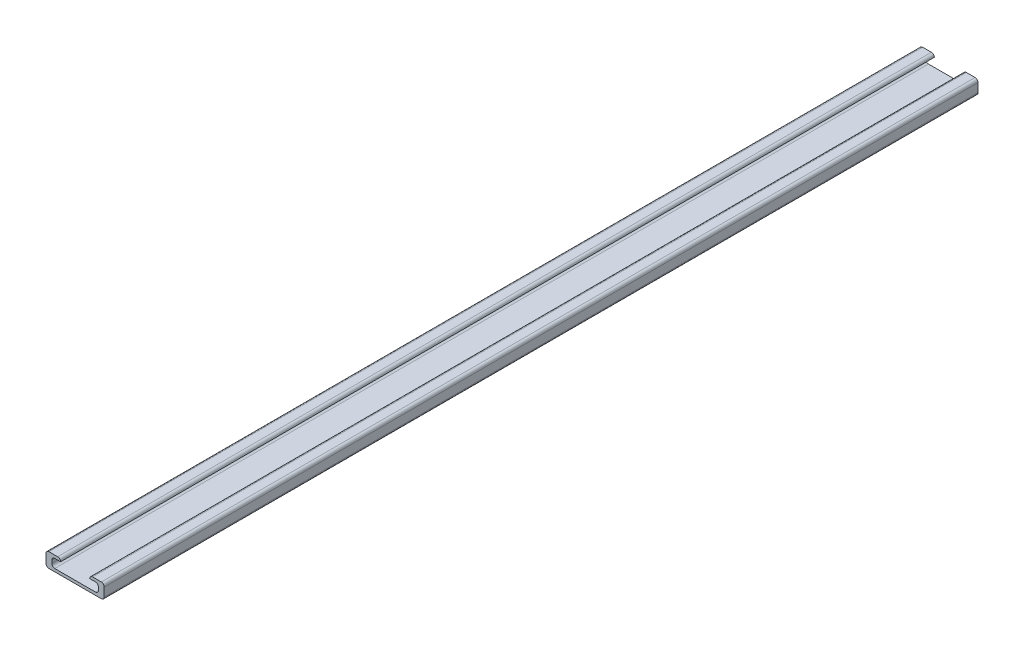
ISO-10303-21;
HEADER;
FILE_DESCRIPTION(('STEP AP214'),'2;1');
FILE_NAME('part.step','',(''),(''),'','','');
FILE_SCHEMA(('AUTOMOTIVE_DESIGN { 1 0 10303 214 1 1 1 1 }'));
ENDSEC;
DATA;
#1=APPLICATION_CONTEXT('core data for automotive mechanical design processes');
#2=APPLICATION_PROTOCOL_DEFINITION('international standard','automotive_design',2000,#1);
#3=PRODUCT_CONTEXT('',#1,'mechanical');
#4=PRODUCT('Part','Part','',(#3));
#5=PRODUCT_RELATED_PRODUCT_CATEGORY('part','',(#4));
#6=PRODUCT_DEFINITION_FORMATION('','',#4);
#7=PRODUCT_DEFINITION_CONTEXT('part definition',#1,'design');
#8=PRODUCT_DEFINITION('design','',#6,#7);
#9=PRODUCT_DEFINITION_SHAPE('','',#8);
#10=(LENGTH_UNIT() NAMED_UNIT(*) SI_UNIT(.MILLI.,.METRE.));
#11=(NAMED_UNIT(*) PLANE_ANGLE_UNIT() SI_UNIT($,.RADIAN.));
#12=(NAMED_UNIT(*) SI_UNIT($,.STERADIAN.) SOLID_ANGLE_UNIT());
#13=UNCERTAINTY_MEASURE_WITH_UNIT(LENGTH_MEASURE(1.E-05),#10,'distance_accuracy_value','');
#14=(GEOMETRIC_REPRESENTATION_CONTEXT(3) GLOBAL_UNCERTAINTY_ASSIGNED_CONTEXT((#13)) GLOBAL_UNIT_ASSIGNED_CONTEXT((#10,
#11,#12)) REPRESENTATION_CONTEXT('',''));
#15=CARTESIAN_POINT('',(0.,0.,0.));
#16=DIRECTION('',(0.,0.,1.));
#17=DIRECTION('',(1.,0.,0.));
#18=AXIS2_PLACEMENT_3D('',#15,#16,#17);
#19=CARTESIAN_POINT('',(0.,4.,300.));
#20=DIRECTION('',(0.,1.,0.));
#21=DIRECTION('',(-1.,0.,0.));
#22=AXIS2_PLACEMENT_3D('',#19,#20,#21);
#23=PLANE('',#22);
#24=DIRECTION('',(1.,0.,0.));
#25=VECTOR('',#24,1.);
#26=CARTESIAN_POINT('',(0.,4.,300.));
#27=LINE('',#26,#25);
#28=CARTESIAN_POINT('',(-17.,4.,300.));
#29=VERTEX_POINT('',#28);
#30=CARTESIAN_POINT('',(-15.,4.,300.));
#31=VERTEX_POINT('',#30);
#32=EDGE_CURVE('E171',#29,#31,#27,.T.);
#33=ORIENTED_EDGE('',*,*,#32,.F.);
#34=DIRECTION('',(0.,0.,-1.));
#35=VECTOR('',#34,1.);
#36=CARTESIAN_POINT('',(-17.,4.,0.));
#37=LINE('',#36,#35);
#38=CARTESIAN_POINT('',(-17.,4.,0.));
#39=VERTEX_POINT('',#38);
#40=EDGE_CURVE('E194',#29,#39,#37,.T.);
#41=ORIENTED_EDGE('',*,*,#40,.T.);
#42=DIRECTION('',(1.,0.,0.));
#43=VECTOR('',#42,1.);
#44=CARTESIAN_POINT('',(0.,4.,0.));
#45=LINE('',#44,#43);
#46=CARTESIAN_POINT('',(-15.,4.,0.));
#47=VERTEX_POINT('',#46);
#48=EDGE_CURVE('E192',#39,#47,#45,.T.);
#49=ORIENTED_EDGE('',*,*,#48,.T.);
#50=DIRECTION('',(0.,0.,-1.));
#51=VECTOR('',#50,1.);
#52=CARTESIAN_POINT('',(-15.,4.,300.));
#53=LINE('',#52,#51);
#54=EDGE_CURVE('E190',#31,#47,#53,.T.);
#55=ORIENTED_EDGE('',*,*,#54,.F.);
#56=EDGE_LOOP('',(#33,#41,#49,#55));
#57=FACE_BOUND('',#56,.T.);
#58=ADVANCED_FACE('F35',(#57),#23,.F.);
#59=CARTESIAN_POINT('',(0.,5.,300.));
#60=DIRECTION('',(0.,1.,0.));
#61=DIRECTION('',(0.,0.,1.));
#62=AXIS2_PLACEMENT_3D('',#59,#60,#61);
#63=PLANE('',#62);
#64=DIRECTION('',(1.,0.,0.));
#65=VECTOR('',#64,1.);
#66=CARTESIAN_POINT('',(0.,5.,0.));
#67=LINE('',#66,#65);
#68=CARTESIAN_POINT('',(-19.,5.,0.));
#69=VERTEX_POINT('',#68);
#70=CARTESIAN_POINT('',(-16.,5.,0.));
#71=VERTEX_POINT('',#70);
#72=EDGE_CURVE('E338',#69,#71,#67,.T.);
#73=ORIENTED_EDGE('',*,*,#72,.F.);
#74=DIRECTION('',(0.,0.,-1.));
#75=VECTOR('',#74,1.);
#76=CARTESIAN_POINT('',(-19.,5.,300.));
#77=LINE('',#76,#75);
#78=CARTESIAN_POINT('',(-19.,5.,300.));
#79=VERTEX_POINT('',#78);
#80=EDGE_CURVE('E211',#69,#79,#77,.F.);
#81=ORIENTED_EDGE('',*,*,#80,.T.);
#82=DIRECTION('',(1.,0.,0.));
#83=VECTOR('',#82,1.);
#84=CARTESIAN_POINT('',(0.,5.,300.));
#85=LINE('',#84,#83);
#86=CARTESIAN_POINT('',(-16.,5.,300.));
#87=VERTEX_POINT('',#86);
#88=EDGE_CURVE('E185',#79,#87,#85,.T.);
#89=ORIENTED_EDGE('',*,*,#88,.T.);
#90=DIRECTION('',(0.,0.,-1.));
#91=VECTOR('',#90,1.);
#92=CARTESIAN_POINT('',(-16.,5.,0.));
#93=LINE('',#92,#91);
#94=EDGE_CURVE('E200',#87,#71,#93,.T.);
#95=ORIENTED_EDGE('',*,*,#94,.T.);
#96=EDGE_LOOP('',(#73,#81,#89,#95));
#97=FACE_BOUND('',#96,.T.);
#98=ADVANCED_FACE('F354',(#97),#63,.T.);
#99=CARTESIAN_POINT('',(-20.,0.,300.));
#100=DIRECTION('',(1.,0.,0.));
#101=DIRECTION('',(0.,0.,-1.));
#102=AXIS2_PLACEMENT_3D('',#99,#100,#101);
#103=PLANE('',#102);
#104=DIRECTION('',(0.,-1.,0.));
#105=VECTOR('',#104,1.);
#106=CARTESIAN_POINT('',(-20.,0.,0.));
#107=LINE('',#106,#105);
#108=CARTESIAN_POINT('',(-20.,4.,0.));
#109=VERTEX_POINT('',#108);
#110=CARTESIAN_POINT('',(-20.,1.,0.));
#111=VERTEX_POINT('',#110);
#112=EDGE_CURVE('E335',#109,#111,#107,.T.);
#113=ORIENTED_EDGE('',*,*,#112,.T.);
#114=DIRECTION('',(0.,0.,-1.));
#115=VECTOR('',#114,1.);
#116=CARTESIAN_POINT('',(-20.,1.,300.));
#117=LINE('',#116,#115);
#118=CARTESIAN_POINT('',(-20.,1.,300.));
#119=VERTEX_POINT('',#118);
#120=EDGE_CURVE('E283',#111,#119,#117,.F.);
#121=ORIENTED_EDGE('',*,*,#120,.T.);
#122=DIRECTION('',(0.,-1.,0.));
#123=VECTOR('',#122,1.);
#124=CARTESIAN_POINT('',(-20.,0.,300.));
#125=LINE('',#124,#123);
#126=CARTESIAN_POINT('',(-20.,4.,300.));
#127=VERTEX_POINT('',#126);
#128=EDGE_CURVE('E350',#127,#119,#125,.T.);
#129=ORIENTED_EDGE('',*,*,#128,.F.);
#130=DIRECTION('',(0.,0.,-1.));
#131=VECTOR('',#130,1.);
#132=CARTESIAN_POINT('',(-20.,4.,0.));
#133=LINE('',#132,#131);
#134=EDGE_CURVE('E280',#127,#109,#133,.T.);
#135=ORIENTED_EDGE('',*,*,#134,.T.);
#136=EDGE_LOOP('',(#113,#121,#129,#135));
#137=FACE_BOUND('',#136,.T.);
#138=ADVANCED_FACE('F363',(#137),#103,.F.);
#139=CARTESIAN_POINT('',(0.,0.,300.));
#140=DIRECTION('',(0.,-1.,0.));
#141=DIRECTION('',(0.,0.,-1.));
#142=AXIS2_PLACEMENT_3D('',#139,#140,#141);
#143=PLANE('',#142);
#144=DIRECTION('',(-1.,0.,0.));
#145=VECTOR('',#144,1.);
#146=CARTESIAN_POINT('',(0.,0.,300.));
#147=LINE('',#146,#145);
#148=CARTESIAN_POINT('',(-1.,0.,300.));
#149=VERTEX_POINT('',#148);
#150=CARTESIAN_POINT('',(-19.,0.,300.));
#151=VERTEX_POINT('',#150);
#152=EDGE_CURVE('E347',#149,#151,#147,.T.);
#153=ORIENTED_EDGE('',*,*,#152,.T.);
#154=DIRECTION('',(0.,0.,-1.));
#155=VECTOR('',#154,1.);
#156=CARTESIAN_POINT('',(-19.,0.,0.));
#157=LINE('',#156,#155);
#158=CARTESIAN_POINT('',(-19.,0.,0.));
#159=VERTEX_POINT('',#158);
#160=EDGE_CURVE('E265',#151,#159,#157,.T.);
#161=ORIENTED_EDGE('',*,*,#160,.T.);
#162=DIRECTION('',(-1.,0.,0.));
#163=VECTOR('',#162,1.);
#164=CARTESIAN_POINT('',(0.,0.,0.));
#165=LINE('',#164,#163);
#166=CARTESIAN_POINT('',(-1.,0.,0.));
#167=VERTEX_POINT('',#166);
#168=EDGE_CURVE('E333',#167,#159,#165,.T.);
#169=ORIENTED_EDGE('',*,*,#168,.F.);
#170=DIRECTION('',(0.,0.,-1.));
#171=VECTOR('',#170,1.);
#172=CARTESIAN_POINT('',(-1.,0.,300.));
#173=LINE('',#172,#171);
#174=EDGE_CURVE('E258',#167,#149,#173,.F.);
#175=ORIENTED_EDGE('',*,*,#174,.T.);
#176=EDGE_LOOP('',(#153,#161,#169,#175));
#177=FACE_BOUND('',#176,.T.);
#178=ADVANCED_FACE('F371',(#177),#143,.T.);
#179=CARTESIAN_POINT('',(0.,0.,300.));
#180=DIRECTION('',(-1.,0.,0.));
#181=DIRECTION('',(0.,0.,1.));
#182=AXIS2_PLACEMENT_3D('',#179,#180,#181);
#183=PLANE('',#182);
#184=DIRECTION('',(0.,1.,0.));
#185=VECTOR('',#184,1.);
#186=CARTESIAN_POINT('',(0.,0.,300.));
#187=LINE('',#186,#185);
#188=CARTESIAN_POINT('',(0.,1.,300.));
#189=VERTEX_POINT('',#188);
#190=CARTESIAN_POINT('',(0.,4.,300.));
#191=VERTEX_POINT('',#190);
#192=EDGE_CURVE('E345',#189,#191,#187,.T.);
#193=ORIENTED_EDGE('',*,*,#192,.F.);
#194=DIRECTION('',(0.,0.,-1.));
#195=VECTOR('',#194,1.);
#196=CARTESIAN_POINT('',(0.,1.,0.));
#197=LINE('',#196,#195);
#198=CARTESIAN_POINT('',(0.,1.,0.));
#199=VERTEX_POINT('',#198);
#200=EDGE_CURVE('E215',#189,#199,#197,.T.);
#201=ORIENTED_EDGE('',*,*,#200,.T.);
#202=DIRECTION('',(0.,1.,0.));
#203=VECTOR('',#202,1.);
#204=CARTESIAN_POINT('',(0.,0.,0.));
#205=LINE('',#204,#203);
#206=CARTESIAN_POINT('',(0.,4.,0.));
#207=VERTEX_POINT('',#206);
#208=EDGE_CURVE('E330',#199,#207,#205,.T.);
#209=ORIENTED_EDGE('',*,*,#208,.T.);
#210=DIRECTION('',(0.,0.,-1.));
#211=VECTOR('',#210,1.);
#212=CARTESIAN_POINT('',(0.,4.,300.));
#213=LINE('',#212,#211);
#214=EDGE_CURVE('E213',#207,#191,#213,.F.);
#215=ORIENTED_EDGE('',*,*,#214,.T.);
#216=EDGE_LOOP('',(#193,#201,#209,#215));
#217=FACE_BOUND('',#216,.T.);
#218=ADVANCED_FACE('F381',(#217),#183,.F.);
#219=CARTESIAN_POINT('',(0.,5.,300.));
#220=DIRECTION('',(0.,-1.,0.));
#221=DIRECTION('',(1.,0.,0.));
#222=AXIS2_PLACEMENT_3D('',#219,#220,#221);
#223=PLANE('',#222);
#224=DIRECTION('',(-1.,0.,0.));
#225=VECTOR('',#224,1.);
#226=CARTESIAN_POINT('',(0.,5.,300.));
#227=LINE('',#226,#225);
#228=CARTESIAN_POINT('',(-1.,5.,300.));
#229=VERTEX_POINT('',#228);
#230=CARTESIAN_POINT('',(-4.,5.,300.));
#231=VERTEX_POINT('',#230);
#232=EDGE_CURVE('E291',#229,#231,#227,.T.);
#233=ORIENTED_EDGE('',*,*,#232,.F.);
#234=DIRECTION('',(0.,0.,-1.));
#235=VECTOR('',#234,1.);
#236=CARTESIAN_POINT('',(-1.,5.,300.));
#237=LINE('',#236,#235);
#238=CARTESIAN_POINT('',(-1.,5.,0.));
#239=VERTEX_POINT('',#238);
#240=EDGE_CURVE('E219',#229,#239,#237,.T.);
#241=ORIENTED_EDGE('',*,*,#240,.T.);
#242=DIRECTION('',(-1.,0.,0.));
#243=VECTOR('',#242,1.);
#244=CARTESIAN_POINT('',(0.,5.,0.));
#245=LINE('',#244,#243);
#246=CARTESIAN_POINT('',(-4.,5.,0.));
#247=VERTEX_POINT('',#246);
#248=EDGE_CURVE('E326',#239,#247,#245,.T.);
#249=ORIENTED_EDGE('',*,*,#248,.T.);
#250=DIRECTION('',(0.,0.,-1.));
#251=VECTOR('',#250,1.);
#252=CARTESIAN_POINT('',(-4.,5.,300.));
#253=LINE('',#252,#251);
#254=EDGE_CURVE('E50',#247,#231,#253,.F.);
#255=ORIENTED_EDGE('',*,*,#254,.T.);
#256=EDGE_LOOP('',(#233,#241,#249,#255));
#257=FACE_BOUND('',#256,.T.);
#258=ADVANCED_FACE('F387',(#257),#223,.F.);
#259=CARTESIAN_POINT('',(0.,4.,300.));
#260=DIRECTION('',(0.,1.,0.));
#261=DIRECTION('',(-1.,0.,0.));
#262=AXIS2_PLACEMENT_3D('',#259,#260,#261);
#263=PLANE('',#262);
#264=DIRECTION('',(1.,0.,0.));
#265=VECTOR('',#264,1.);
#266=CARTESIAN_POINT('',(0.,4.,0.));
#267=LINE('',#266,#265);
#268=CARTESIAN_POINT('',(-5.,4.,0.));
#269=VERTEX_POINT('',#268);
#270=CARTESIAN_POINT('',(-3.,4.,0.));
#271=VERTEX_POINT('',#270);
#272=EDGE_CURVE('E324',#269,#271,#267,.T.);
#273=ORIENTED_EDGE('',*,*,#272,.T.);
#274=DIRECTION('',(0.,0.,-1.));
#275=VECTOR('',#274,1.);
#276=CARTESIAN_POINT('',(-3.,4.,300.));
#277=LINE('',#276,#275);
#278=CARTESIAN_POINT('',(-3.,4.,300.));
#279=VERTEX_POINT('',#278);
#280=EDGE_CURVE('E256',#271,#279,#277,.F.);
#281=ORIENTED_EDGE('',*,*,#280,.T.);
#282=DIRECTION('',(1.,0.,0.));
#283=VECTOR('',#282,1.);
#284=CARTESIAN_POINT('',(0.,4.,300.));
#285=LINE('',#284,#283);
#286=CARTESIAN_POINT('',(-5.,4.,300.));
#287=VERTEX_POINT('',#286);
#288=EDGE_CURVE('E289',#287,#279,#285,.T.);
#289=ORIENTED_EDGE('',*,*,#288,.F.);
#290=DIRECTION('',(0.,0.,-1.));
#291=VECTOR('',#290,1.);
#292=CARTESIAN_POINT('',(-5.,4.,300.));
#293=LINE('',#292,#291);
#294=EDGE_CURVE('E195',#287,#269,#293,.T.);
#295=ORIENTED_EDGE('',*,*,#294,.T.);
#296=EDGE_LOOP('',(#273,#281,#289,#295));
#297=FACE_BOUND('',#296,.T.);
#298=ADVANCED_FACE('F297',(#297),#263,.F.);
#299=CARTESIAN_POINT('',(-2.,0.,300.));
#300=DIRECTION('',(1.,0.,0.));
#301=DIRECTION('',(0.,1.,0.));
#302=AXIS2_PLACEMENT_3D('',#299,#300,#301);
#303=PLANE('',#302);
#304=DIRECTION('',(0.,-1.,0.));
#305=VECTOR('',#304,1.);
#306=CARTESIAN_POINT('',(-2.,0.,300.));
#307=LINE('',#306,#305);
#308=CARTESIAN_POINT('',(-2.,3.,300.));
#309=VERTEX_POINT('',#308);
#310=CARTESIAN_POINT('',(-2.,2.,300.));
#311=VERTEX_POINT('',#310);
#312=EDGE_CURVE('E300',#309,#311,#307,.T.);
#313=ORIENTED_EDGE('',*,*,#312,.F.);
#314=DIRECTION('',(0.,0.,-1.));
#315=VECTOR('',#314,1.);
#316=CARTESIAN_POINT('',(-2.,3.,0.));
#317=LINE('',#316,#315);
#318=CARTESIAN_POINT('',(-2.,3.,0.));
#319=VERTEX_POINT('',#318);
#320=EDGE_CURVE('E260',#309,#319,#317,.T.);
#321=ORIENTED_EDGE('',*,*,#320,.T.);
#322=DIRECTION('',(0.,-1.,0.));
#323=VECTOR('',#322,1.);
#324=CARTESIAN_POINT('',(-2.,0.,0.));
#325=LINE('',#324,#323);
#326=CARTESIAN_POINT('',(-2.,2.,0.));
#327=VERTEX_POINT('',#326);
#328=EDGE_CURVE('E252',#319,#327,#325,.T.);
#329=ORIENTED_EDGE('',*,*,#328,.T.);
#330=DIRECTION('',(0.,0.,-1.));
#331=VECTOR('',#330,1.);
#332=CARTESIAN_POINT('',(-2.,2.,300.));
#333=LINE('',#332,#331);
#334=EDGE_CURVE('E313',#327,#311,#333,.F.);
#335=ORIENTED_EDGE('',*,*,#334,.T.);
#336=EDGE_LOOP('',(#313,#321,#329,#335));
#337=FACE_BOUND('',#336,.T.);
#338=ADVANCED_FACE('F320',(#337),#303,.F.);
#339=CARTESIAN_POINT('',(0.,1.,300.));
#340=DIRECTION('',(0.,-1.,0.));
#341=DIRECTION('',(1.,0.,0.));
#342=AXIS2_PLACEMENT_3D('',#339,#340,#341);
#343=PLANE('',#342);
#344=DIRECTION('',(-1.,0.,0.));
#345=VECTOR('',#344,1.);
#346=CARTESIAN_POINT('',(0.,1.,300.));
#347=LINE('',#346,#345);
#348=CARTESIAN_POINT('',(-3.,1.,300.));
#349=VERTEX_POINT('',#348);
#350=CARTESIAN_POINT('',(-17.,0.999999999999998,300.));
#351=VERTEX_POINT('',#350);
#352=EDGE_CURVE('E304',#349,#351,#347,.T.);
#353=ORIENTED_EDGE('',*,*,#352,.F.);
#354=DIRECTION('',(0.,0.,-1.));
#355=VECTOR('',#354,1.);
#356=CARTESIAN_POINT('',(-3.,1.,0.));
#357=LINE('',#356,#355);
#358=CARTESIAN_POINT('',(-3.,1.,0.));
#359=VERTEX_POINT('',#358);
#360=EDGE_CURVE('E251',#349,#359,#357,.T.);
#361=ORIENTED_EDGE('',*,*,#360,.T.);
#362=DIRECTION('',(-1.,0.,0.));
#363=VECTOR('',#362,1.);
#364=CARTESIAN_POINT('',(0.,1.,0.));
#365=LINE('',#364,#363);
#366=CARTESIAN_POINT('',(-17.,0.999999999999998,0.));
#367=VERTEX_POINT('',#366);
#368=EDGE_CURVE('E238',#359,#367,#365,.T.);
#369=ORIENTED_EDGE('',*,*,#368,.T.);
#370=DIRECTION('',(0.,0.,-1.));
#371=VECTOR('',#370,1.);
#372=CARTESIAN_POINT('',(-17.,0.999999999999998,300.));
#373=LINE('',#372,#371);
#374=EDGE_CURVE('E248',#367,#351,#373,.F.);
#375=ORIENTED_EDGE('',*,*,#374,.T.);
#376=EDGE_LOOP('',(#353,#361,#369,#375));
#377=FACE_BOUND('',#376,.T.);
#378=ADVANCED_FACE('F247',(#377),#343,.F.);
#379=CARTESIAN_POINT('',(-18.,0.,300.));
#380=DIRECTION('',(-1.,0.,0.));
#381=DIRECTION('',(0.,0.,1.));
#382=AXIS2_PLACEMENT_3D('',#379,#380,#381);
#383=PLANE('',#382);
#384=DIRECTION('',(0.,1.,0.));
#385=VECTOR('',#384,1.);
#386=CARTESIAN_POINT('',(-18.,0.,0.));
#387=LINE('',#386,#385);
#388=CARTESIAN_POINT('',(-18.,2.,0.));
#389=VERTEX_POINT('',#388);
#390=CARTESIAN_POINT('',(-18.,3.,0.));
#391=VERTEX_POINT('',#390);
#392=EDGE_CURVE('E186',#389,#391,#387,.T.);
#393=ORIENTED_EDGE('',*,*,#392,.T.);
#394=DIRECTION('',(0.,0.,-1.));
#395=VECTOR('',#394,1.);
#396=CARTESIAN_POINT('',(-18.,3.,300.));
#397=LINE('',#396,#395);
#398=CARTESIAN_POINT('',(-18.,3.,300.));
#399=VERTEX_POINT('',#398);
#400=EDGE_CURVE('E311',#391,#399,#397,.F.);
#401=ORIENTED_EDGE('',*,*,#400,.T.);
#402=DIRECTION('',(0.,1.,0.));
#403=VECTOR('',#402,1.);
#404=CARTESIAN_POINT('',(-18.,0.,300.));
#405=LINE('',#404,#403);
#406=CARTESIAN_POINT('',(-18.,2.,300.));
#407=VERTEX_POINT('',#406);
#408=EDGE_CURVE('E302',#407,#399,#405,.T.);
#409=ORIENTED_EDGE('',*,*,#408,.F.);
#410=DIRECTION('',(0.,0.,-1.));
#411=VECTOR('',#410,1.);
#412=CARTESIAN_POINT('',(-18.,2.,0.));
#413=LINE('',#412,#411);
#414=EDGE_CURVE('E309',#407,#389,#413,.T.);
#415=ORIENTED_EDGE('',*,*,#414,.T.);
#416=EDGE_LOOP('',(#393,#401,#409,#415));
#417=FACE_BOUND('',#416,.T.);
#418=ADVANCED_FACE('F499',(#417),#383,.F.);
#419=CARTESIAN_POINT('',(0.,0.,300.));
#420=DIRECTION('',(0.,0.,1.));
#421=DIRECTION('',(1.,0.,0.));
#422=AXIS2_PLACEMENT_3D('',#419,#420,#421);
#423=PLANE('',#422);
#424=ORIENTED_EDGE('',*,*,#128,.T.);
#425=CARTESIAN_POINT('',(-19.,1.,300.));
#426=DIRECTION('',(0.,0.,1.));
#427=DIRECTION('',(1.,0.,0.));
#428=AXIS2_PLACEMENT_3D('',#425,#426,#427);
#429=CIRCLE('',#428,1.);
#430=EDGE_CURVE('E204',#119,#151,#429,.T.);
#431=ORIENTED_EDGE('',*,*,#430,.T.);
#432=ORIENTED_EDGE('',*,*,#152,.F.);
#433=CARTESIAN_POINT('',(-1.,1.,300.));
#434=DIRECTION('',(0.,0.,1.));
#435=DIRECTION('',(1.,0.,0.));
#436=AXIS2_PLACEMENT_3D('',#433,#434,#435);
#437=CIRCLE('',#436,1.);
#438=EDGE_CURVE('E202',#149,#189,#437,.T.);
#439=ORIENTED_EDGE('',*,*,#438,.T.);
#440=ORIENTED_EDGE('',*,*,#192,.T.);
#441=CARTESIAN_POINT('',(-1.,4.,300.));
#442=DIRECTION('',(0.,0.,1.));
#443=DIRECTION('',(1.,0.,0.));
#444=AXIS2_PLACEMENT_3D('',#441,#442,#443);
#445=CIRCLE('',#444,1.);
#446=EDGE_CURVE('E57',#191,#229,#445,.T.);
#447=ORIENTED_EDGE('',*,*,#446,.T.);
#448=ORIENTED_EDGE('',*,*,#232,.T.);
#449=CARTESIAN_POINT('',(-4.,4.,300.));
#450=DIRECTION('',(0.,0.,1.));
#451=DIRECTION('',(1.,0.,0.));
#452=AXIS2_PLACEMENT_3D('',#449,#450,#451);
#453=CIRCLE('',#452,1.);
#454=EDGE_CURVE('E285',#231,#287,#453,.T.);
#455=ORIENTED_EDGE('',*,*,#454,.T.);
#456=ORIENTED_EDGE('',*,*,#288,.T.);
#457=CARTESIAN_POINT('',(-3.,3.,300.));
#458=DIRECTION('',(0.,0.,1.));
#459=DIRECTION('',(1.,0.,0.));
#460=AXIS2_PLACEMENT_3D('',#457,#458,#459);
#461=CIRCLE('',#460,1.);
#462=EDGE_CURVE('E227',#279,#309,#461,.F.);
#463=ORIENTED_EDGE('',*,*,#462,.T.);
#464=ORIENTED_EDGE('',*,*,#312,.T.);
#465=CARTESIAN_POINT('',(-3.,2.,300.));
#466=DIRECTION('',(0.,0.,1.));
#467=DIRECTION('',(1.,0.,0.));
#468=AXIS2_PLACEMENT_3D('',#465,#466,#467);
#469=CIRCLE('',#468,1.);
#470=EDGE_CURVE('E231',#311,#349,#469,.F.);
#471=ORIENTED_EDGE('',*,*,#470,.T.);
#472=ORIENTED_EDGE('',*,*,#352,.T.);
#473=CARTESIAN_POINT('',(-17.,2.,300.));
#474=DIRECTION('',(0.,0.,1.));
#475=DIRECTION('',(1.,0.,0.));
#476=AXIS2_PLACEMENT_3D('',#473,#474,#475);
#477=CIRCLE('',#476,1.);
#478=EDGE_CURVE('E11',#351,#407,#477,.F.);
#479=ORIENTED_EDGE('',*,*,#478,.T.);
#480=ORIENTED_EDGE('',*,*,#408,.T.);
#481=CARTESIAN_POINT('',(-17.,3.,300.));
#482=DIRECTION('',(0.,0.,1.));
#483=DIRECTION('',(1.,0.,0.));
#484=AXIS2_PLACEMENT_3D('',#481,#482,#483);
#485=CIRCLE('',#484,1.);
#486=EDGE_CURVE('E181',#399,#29,#485,.F.);
#487=ORIENTED_EDGE('',*,*,#486,.T.);
#488=ORIENTED_EDGE('',*,*,#32,.T.);
#489=CARTESIAN_POINT('',(-16.,4.,300.));
#490=DIRECTION('',(0.,0.,1.));
#491=DIRECTION('',(1.,0.,0.));
#492=AXIS2_PLACEMENT_3D('',#489,#490,#491);
#493=CIRCLE('',#492,1.);
#494=EDGE_CURVE('E177',#31,#87,#493,.T.);
#495=ORIENTED_EDGE('',*,*,#494,.T.);
#496=ORIENTED_EDGE('',*,*,#88,.F.);
#497=CARTESIAN_POINT('',(-19.,4.,300.));
#498=DIRECTION('',(0.,0.,1.));
#499=DIRECTION('',(1.,0.,0.));
#500=AXIS2_PLACEMENT_3D('',#497,#498,#499);
#501=CIRCLE('',#500,1.);
#502=EDGE_CURVE('E201',#79,#127,#501,.T.);
#503=ORIENTED_EDGE('',*,*,#502,.T.);
#504=EDGE_LOOP('',(#424,#431,#432,#439,#440,#447,#448,#455,#456,#463,#464,#471,#472,#479,#480,
#487,#488,#495,#496,#503));
#505=FACE_BOUND('',#504,.T.);
#506=ADVANCED_FACE('F174',(#505),#423,.T.);
#507=CARTESIAN_POINT('',(0.,0.,0.));
#508=DIRECTION('',(0.,0.,1.));
#509=DIRECTION('',(1.,0.,0.));
#510=AXIS2_PLACEMENT_3D('',#507,#508,#509);
#511=PLANE('',#510);
#512=ORIENTED_EDGE('',*,*,#168,.T.);
#513=CARTESIAN_POINT('',(-19.,1.,0.));
#514=DIRECTION('',(0.,0.,1.));
#515=DIRECTION('',(1.,0.,0.));
#516=AXIS2_PLACEMENT_3D('',#513,#514,#515);
#517=CIRCLE('',#516,1.);
#518=EDGE_CURVE('E278',#159,#111,#517,.F.);
#519=ORIENTED_EDGE('',*,*,#518,.T.);
#520=ORIENTED_EDGE('',*,*,#112,.F.);
#521=CARTESIAN_POINT('',(-19.,4.,0.));
#522=DIRECTION('',(0.,0.,1.));
#523=DIRECTION('',(1.,0.,0.));
#524=AXIS2_PLACEMENT_3D('',#521,#522,#523);
#525=CIRCLE('',#524,1.);
#526=EDGE_CURVE('E276',#109,#69,#525,.F.);
#527=ORIENTED_EDGE('',*,*,#526,.T.);
#528=ORIENTED_EDGE('',*,*,#72,.T.);
#529=CARTESIAN_POINT('',(-16.,4.,0.));
#530=DIRECTION('',(0.,0.,1.));
#531=DIRECTION('',(1.,0.,0.));
#532=AXIS2_PLACEMENT_3D('',#529,#530,#531);
#533=CIRCLE('',#532,1.);
#534=EDGE_CURVE('E274',#71,#47,#533,.F.);
#535=ORIENTED_EDGE('',*,*,#534,.T.);
#536=ORIENTED_EDGE('',*,*,#48,.F.);
#537=CARTESIAN_POINT('',(-17.,3.,0.));
#538=DIRECTION('',(0.,0.,1.));
#539=DIRECTION('',(1.,0.,0.));
#540=AXIS2_PLACEMENT_3D('',#537,#538,#539);
#541=CIRCLE('',#540,1.);
#542=EDGE_CURVE('E222',#39,#391,#541,.T.);
#543=ORIENTED_EDGE('',*,*,#542,.T.);
#544=ORIENTED_EDGE('',*,*,#392,.F.);
#545=CARTESIAN_POINT('',(-17.,2.,0.));
#546=DIRECTION('',(0.,0.,1.));
#547=DIRECTION('',(1.,0.,0.));
#548=AXIS2_PLACEMENT_3D('',#545,#546,#547);
#549=CIRCLE('',#548,1.);
#550=EDGE_CURVE('E43',#389,#367,#549,.T.);
#551=ORIENTED_EDGE('',*,*,#550,.T.);
#552=ORIENTED_EDGE('',*,*,#368,.F.);
#553=CARTESIAN_POINT('',(-3.,2.,0.));
#554=DIRECTION('',(0.,0.,1.));
#555=DIRECTION('',(1.,0.,0.));
#556=AXIS2_PLACEMENT_3D('',#553,#554,#555);
#557=CIRCLE('',#556,1.);
#558=EDGE_CURVE('E229',#359,#327,#557,.T.);
#559=ORIENTED_EDGE('',*,*,#558,.T.);
#560=ORIENTED_EDGE('',*,*,#328,.F.);
#561=CARTESIAN_POINT('',(-3.,3.,0.));
#562=DIRECTION('',(0.,0.,1.));
#563=DIRECTION('',(1.,0.,0.));
#564=AXIS2_PLACEMENT_3D('',#561,#562,#563);
#565=CIRCLE('',#564,1.);
#566=EDGE_CURVE('E225',#319,#271,#565,.T.);
#567=ORIENTED_EDGE('',*,*,#566,.T.);
#568=ORIENTED_EDGE('',*,*,#272,.F.);
#569=CARTESIAN_POINT('',(-4.,4.,0.));
#570=DIRECTION('',(0.,0.,1.));
#571=DIRECTION('',(1.,0.,0.));
#572=AXIS2_PLACEMENT_3D('',#569,#570,#571);
#573=CIRCLE('',#572,1.);
#574=EDGE_CURVE('E268',#269,#247,#573,.F.);
#575=ORIENTED_EDGE('',*,*,#574,.T.);
#576=ORIENTED_EDGE('',*,*,#248,.F.);
#577=CARTESIAN_POINT('',(-1.,4.,0.));
#578=DIRECTION('',(0.,0.,1.));
#579=DIRECTION('',(1.,0.,0.));
#580=AXIS2_PLACEMENT_3D('',#577,#578,#579);
#581=CIRCLE('',#580,1.);
#582=EDGE_CURVE('E270',#239,#207,#581,.F.);
#583=ORIENTED_EDGE('',*,*,#582,.T.);
#584=ORIENTED_EDGE('',*,*,#208,.F.);
#585=CARTESIAN_POINT('',(-1.,1.,0.));
#586=DIRECTION('',(0.,0.,1.));
#587=DIRECTION('',(1.,0.,0.));
#588=AXIS2_PLACEMENT_3D('',#585,#586,#587);
#589=CIRCLE('',#588,1.);
#590=EDGE_CURVE('E272',#199,#167,#589,.F.);
#591=ORIENTED_EDGE('',*,*,#590,.T.);
#592=EDGE_LOOP('',(#512,#519,#520,#527,#528,#535,#536,#543,#544,#551,#552,#559,#560,#567,#568,
#575,#576,#583,#584,#591));
#593=FACE_BOUND('',#592,.T.);
#594=ADVANCED_FACE('F237',(#593),#511,.F.);
#595=CARTESIAN_POINT('',(-17.,3.,300.));
#596=DIRECTION('',(0.,0.,1.));
#597=DIRECTION('',(1.,0.,0.));
#598=AXIS2_PLACEMENT_3D('',#595,#596,#597);
#599=CYLINDRICAL_SURFACE('',#598,1.);
#600=ORIENTED_EDGE('',*,*,#486,.F.);
#601=ORIENTED_EDGE('',*,*,#400,.F.);
#602=ORIENTED_EDGE('',*,*,#542,.F.);
#603=ORIENTED_EDGE('',*,*,#40,.F.);
#604=EDGE_LOOP('',(#600,#601,#602,#603));
#605=FACE_BOUND('',#604,.T.);
#606=ADVANCED_FACE('F404',(#605),#599,.F.);
#607=CARTESIAN_POINT('',(-3.,3.,300.));
#608=DIRECTION('',(0.,0.,1.));
#609=DIRECTION('',(1.,0.,0.));
#610=AXIS2_PLACEMENT_3D('',#607,#608,#609);
#611=CYLINDRICAL_SURFACE('',#610,1.);
#612=ORIENTED_EDGE('',*,*,#462,.F.);
#613=ORIENTED_EDGE('',*,*,#280,.F.);
#614=ORIENTED_EDGE('',*,*,#566,.F.);
#615=ORIENTED_EDGE('',*,*,#320,.F.);
#616=EDGE_LOOP('',(#612,#613,#614,#615));
#617=FACE_BOUND('',#616,.T.);
#618=ADVANCED_FACE('F407',(#617),#611,.F.);
#619=CARTESIAN_POINT('',(-3.,2.,300.));
#620=DIRECTION('',(0.,0.,1.));
#621=DIRECTION('',(1.,0.,0.));
#622=AXIS2_PLACEMENT_3D('',#619,#620,#621);
#623=CYLINDRICAL_SURFACE('',#622,1.);
#624=ORIENTED_EDGE('',*,*,#470,.F.);
#625=ORIENTED_EDGE('',*,*,#334,.F.);
#626=ORIENTED_EDGE('',*,*,#558,.F.);
#627=ORIENTED_EDGE('',*,*,#360,.F.);
#628=EDGE_LOOP('',(#624,#625,#626,#627));
#629=FACE_BOUND('',#628,.T.);
#630=ADVANCED_FACE('F411',(#629),#623,.F.);
#631=CARTESIAN_POINT('',(-17.,2.,300.));
#632=DIRECTION('',(0.,0.,1.));
#633=DIRECTION('',(1.,0.,0.));
#634=AXIS2_PLACEMENT_3D('',#631,#632,#633);
#635=CYLINDRICAL_SURFACE('',#634,1.);
#636=ORIENTED_EDGE('',*,*,#478,.F.);
#637=ORIENTED_EDGE('',*,*,#374,.F.);
#638=ORIENTED_EDGE('',*,*,#550,.F.);
#639=ORIENTED_EDGE('',*,*,#414,.F.);
#640=EDGE_LOOP('',(#636,#637,#638,#639));
#641=FACE_BOUND('',#640,.T.);
#642=ADVANCED_FACE('F255',(#641),#635,.F.);
#643=CARTESIAN_POINT('',(-19.,1.,300.));
#644=DIRECTION('',(0.,0.,1.));
#645=DIRECTION('',(1.,0.,0.));
#646=AXIS2_PLACEMENT_3D('',#643,#644,#645);
#647=CYLINDRICAL_SURFACE('',#646,1.);
#648=ORIENTED_EDGE('',*,*,#430,.F.);
#649=ORIENTED_EDGE('',*,*,#120,.F.);
#650=ORIENTED_EDGE('',*,*,#518,.F.);
#651=ORIENTED_EDGE('',*,*,#160,.F.);
#652=EDGE_LOOP('',(#648,#649,#650,#651));
#653=FACE_BOUND('',#652,.T.);
#654=ADVANCED_FACE('F369',(#653),#647,.T.);
#655=CARTESIAN_POINT('',(-19.,4.,300.));
#656=DIRECTION('',(0.,0.,1.));
#657=DIRECTION('',(1.,0.,0.));
#658=AXIS2_PLACEMENT_3D('',#655,#656,#657);
#659=CYLINDRICAL_SURFACE('',#658,1.);
#660=ORIENTED_EDGE('',*,*,#502,.F.);
#661=ORIENTED_EDGE('',*,*,#80,.F.);
#662=ORIENTED_EDGE('',*,*,#526,.F.);
#663=ORIENTED_EDGE('',*,*,#134,.F.);
#664=EDGE_LOOP('',(#660,#661,#662,#663));
#665=FACE_BOUND('',#664,.T.);
#666=ADVANCED_FACE('F360',(#665),#659,.T.);
#667=CARTESIAN_POINT('',(-16.,4.,300.));
#668=DIRECTION('',(0.,0.,1.));
#669=DIRECTION('',(1.,0.,0.));
#670=AXIS2_PLACEMENT_3D('',#667,#668,#669);
#671=CYLINDRICAL_SURFACE('',#670,1.);
#672=ORIENTED_EDGE('',*,*,#494,.F.);
#673=ORIENTED_EDGE('',*,*,#54,.T.);
#674=ORIENTED_EDGE('',*,*,#534,.F.);
#675=ORIENTED_EDGE('',*,*,#94,.F.);
#676=EDGE_LOOP('',(#672,#673,#674,#675));
#677=FACE_BOUND('',#676,.T.);
#678=ADVANCED_FACE('F198',(#677),#671,.T.);
#679=CARTESIAN_POINT('',(-1.,1.,300.));
#680=DIRECTION('',(0.,0.,1.));
#681=DIRECTION('',(1.,0.,0.));
#682=AXIS2_PLACEMENT_3D('',#679,#680,#681);
#683=CYLINDRICAL_SURFACE('',#682,1.);
#684=ORIENTED_EDGE('',*,*,#438,.F.);
#685=ORIENTED_EDGE('',*,*,#174,.F.);
#686=ORIENTED_EDGE('',*,*,#590,.F.);
#687=ORIENTED_EDGE('',*,*,#200,.F.);
#688=EDGE_LOOP('',(#684,#685,#686,#687));
#689=FACE_BOUND('',#688,.T.);
#690=ADVANCED_FACE('F378',(#689),#683,.T.);
#691=CARTESIAN_POINT('',(-1.,4.,300.));
#692=DIRECTION('',(0.,0.,-1.));
#693=DIRECTION('',(-1.,0.,0.));
#694=AXIS2_PLACEMENT_3D('',#691,#692,#693);
#695=CYLINDRICAL_SURFACE('',#694,1.);
#696=ORIENTED_EDGE('',*,*,#446,.F.);
#697=ORIENTED_EDGE('',*,*,#214,.F.);
#698=ORIENTED_EDGE('',*,*,#582,.F.);
#699=ORIENTED_EDGE('',*,*,#240,.F.);
#700=EDGE_LOOP('',(#696,#697,#698,#699));
#701=FACE_BOUND('',#700,.T.);
#702=ADVANCED_FACE('F386',(#701),#695,.T.);
#703=CARTESIAN_POINT('',(-4.,4.,300.));
#704=DIRECTION('',(0.,0.,-1.));
#705=DIRECTION('',(-1.,0.,0.));
#706=AXIS2_PLACEMENT_3D('',#703,#704,#705);
#707=CYLINDRICAL_SURFACE('',#706,1.);
#708=ORIENTED_EDGE('',*,*,#454,.F.);
#709=ORIENTED_EDGE('',*,*,#254,.F.);
#710=ORIENTED_EDGE('',*,*,#574,.F.);
#711=ORIENTED_EDGE('',*,*,#294,.F.);
#712=EDGE_LOOP('',(#708,#709,#710,#711));
#713=FACE_BOUND('',#712,.T.);
#714=ADVANCED_FACE('F37',(#713),#707,.T.);
#715=CLOSED_SHELL('',(#58,#98,#138,#178,#218,#258,#298,#338,#378,#418,#506,#594,#606,#618,#630,
#642,#654,#666,#678,#690,#702,#714));
#716=MANIFOLD_SOLID_BREP('B2',#715);
#717=ADVANCED_BREP_SHAPE_REPRESENTATION('',(#18,#716),#14);
#718=SHAPE_DEFINITION_REPRESENTATION(#9,#717);
ENDSEC;
END-ISO-10303-21;
